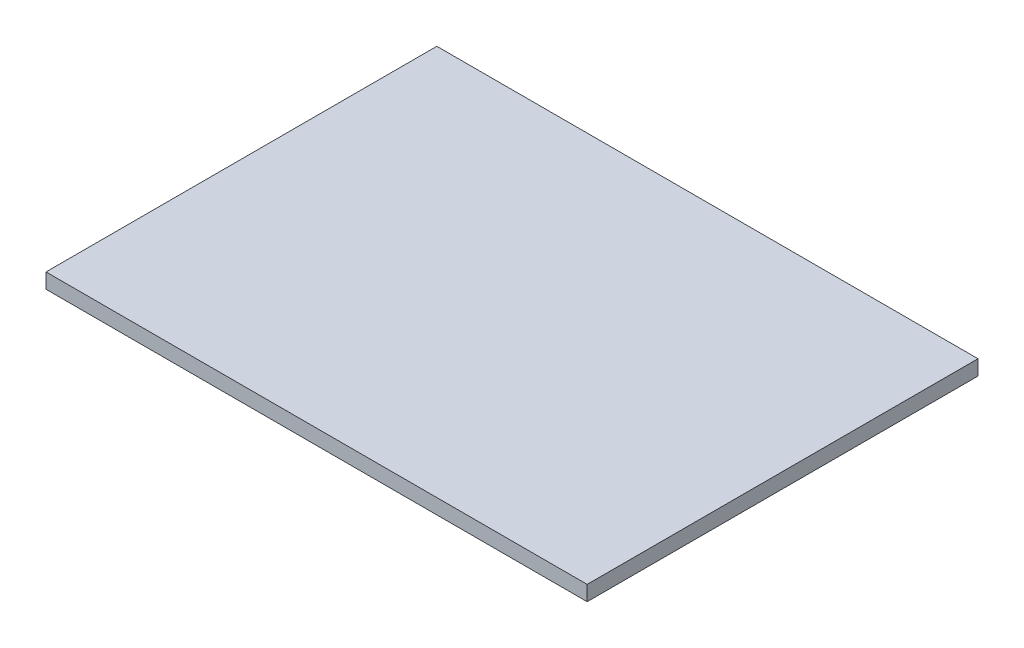
ISO-10303-21;
HEADER;
FILE_DESCRIPTION(('STEP AP214'),'2;1');
FILE_NAME('part.step','',(''),(''),'','','');
FILE_SCHEMA(('AUTOMOTIVE_DESIGN { 1 0 10303 214 1 1 1 1 }'));
ENDSEC;
DATA;
#1=APPLICATION_CONTEXT('core data for automotive mechanical design processes');
#2=APPLICATION_PROTOCOL_DEFINITION('international standard','automotive_design',2000,#1);
#3=PRODUCT_CONTEXT('',#1,'mechanical');
#4=PRODUCT('Part','Part','',(#3));
#5=PRODUCT_RELATED_PRODUCT_CATEGORY('part','',(#4));
#6=PRODUCT_DEFINITION_FORMATION('','',#4);
#7=PRODUCT_DEFINITION_CONTEXT('part definition',#1,'design');
#8=PRODUCT_DEFINITION('design','',#6,#7);
#9=PRODUCT_DEFINITION_SHAPE('','',#8);
#10=(LENGTH_UNIT() NAMED_UNIT(*) SI_UNIT(.MILLI.,.METRE.));
#11=(NAMED_UNIT(*) PLANE_ANGLE_UNIT() SI_UNIT($,.RADIAN.));
#12=(NAMED_UNIT(*) SI_UNIT($,.STERADIAN.) SOLID_ANGLE_UNIT());
#13=UNCERTAINTY_MEASURE_WITH_UNIT(LENGTH_MEASURE(1.E-05),#10,'distance_accuracy_value','');
#14=(GEOMETRIC_REPRESENTATION_CONTEXT(3) GLOBAL_UNCERTAINTY_ASSIGNED_CONTEXT((#13)) GLOBAL_UNIT_ASSIGNED_CONTEXT((#10,
#11,#12)) REPRESENTATION_CONTEXT('',''));
#15=CARTESIAN_POINT('',(0.,0.,0.));
#16=DIRECTION('',(0.,0.,1.));
#17=DIRECTION('',(1.,0.,0.));
#18=AXIS2_PLACEMENT_3D('',#15,#16,#17);
#19=CARTESIAN_POINT('',(0.,5.,0.));
#20=DIRECTION('',(1.,0.,0.));
#21=DIRECTION('',(0.,0.,-1.));
#22=AXIS2_PLACEMENT_3D('',#19,#20,#21);
#23=PLANE('',#22);
#24=DIRECTION('',(0.,0.,1.));
#25=VECTOR('',#24,1.);
#26=CARTESIAN_POINT('',(0.,0.,0.));
#27=LINE('',#26,#25);
#28=CARTESIAN_POINT('',(0.,0.,0.));
#29=VERTEX_POINT('',#28);
#30=CARTESIAN_POINT('',(0.,0.,130.));
#31=VERTEX_POINT('',#30);
#32=EDGE_CURVE('E96',#29,#31,#27,.T.);
#33=ORIENTED_EDGE('',*,*,#32,.T.);
#34=DIRECTION('',(0.,-1.,0.));
#35=VECTOR('',#34,1.);
#36=CARTESIAN_POINT('',(0.,5.,130.));
#37=LINE('',#36,#35);
#38=CARTESIAN_POINT('',(0.,5.,130.));
#39=VERTEX_POINT('',#38);
#40=EDGE_CURVE('E11',#39,#31,#37,.T.);
#41=ORIENTED_EDGE('',*,*,#40,.F.);
#42=DIRECTION('',(0.,0.,1.));
#43=VECTOR('',#42,1.);
#44=CARTESIAN_POINT('',(0.,5.,0.));
#45=LINE('',#44,#43);
#46=CARTESIAN_POINT('',(0.,5.,0.));
#47=VERTEX_POINT('',#46);
#48=EDGE_CURVE('E84',#47,#39,#45,.T.);
#49=ORIENTED_EDGE('',*,*,#48,.F.);
#50=DIRECTION('',(0.,-1.,0.));
#51=VECTOR('',#50,1.);
#52=CARTESIAN_POINT('',(0.,5.,0.));
#53=LINE('',#52,#51);
#54=EDGE_CURVE('E92',#47,#29,#53,.T.);
#55=ORIENTED_EDGE('',*,*,#54,.T.);
#56=EDGE_LOOP('',(#33,#41,#49,#55));
#57=FACE_BOUND('',#56,.T.);
#58=ADVANCED_FACE('F33',(#57),#23,.F.);
#59=CARTESIAN_POINT('',(0.,5.,130.));
#60=DIRECTION('',(0.,0.,-1.));
#61=DIRECTION('',(-1.,0.,0.));
#62=AXIS2_PLACEMENT_3D('',#59,#60,#61);
#63=PLANE('',#62);
#64=DIRECTION('',(1.,0.,0.));
#65=VECTOR('',#64,1.);
#66=CARTESIAN_POINT('',(0.,0.,130.));
#67=LINE('',#66,#65);
#68=CARTESIAN_POINT('',(180.,0.,130.));
#69=VERTEX_POINT('',#68);
#70=EDGE_CURVE('E88',#31,#69,#67,.T.);
#71=ORIENTED_EDGE('',*,*,#70,.T.);
#72=DIRECTION('',(0.,-1.,0.));
#73=VECTOR('',#72,1.);
#74=CARTESIAN_POINT('',(180.,5.,130.));
#75=LINE('',#74,#73);
#76=CARTESIAN_POINT('',(180.,5.,130.));
#77=VERTEX_POINT('',#76);
#78=EDGE_CURVE('E41',#77,#69,#75,.T.);
#79=ORIENTED_EDGE('',*,*,#78,.F.);
#80=DIRECTION('',(1.,0.,0.));
#81=VECTOR('',#80,1.);
#82=CARTESIAN_POINT('',(0.,5.,130.));
#83=LINE('',#82,#81);
#84=EDGE_CURVE('E79',#39,#77,#83,.T.);
#85=ORIENTED_EDGE('',*,*,#84,.F.);
#86=ORIENTED_EDGE('',*,*,#40,.T.);
#87=EDGE_LOOP('',(#71,#79,#85,#86));
#88=FACE_BOUND('',#87,.T.);
#89=ADVANCED_FACE('F87',(#88),#63,.F.);
#90=CARTESIAN_POINT('',(180.,5.,0.));
#91=DIRECTION('',(-1.,0.,0.));
#92=DIRECTION('',(0.,0.,1.));
#93=AXIS2_PLACEMENT_3D('',#90,#91,#92);
#94=PLANE('',#93);
#95=DIRECTION('',(0.,0.,-1.));
#96=VECTOR('',#95,1.);
#97=CARTESIAN_POINT('',(180.,0.,0.));
#98=LINE('',#97,#96);
#99=CARTESIAN_POINT('',(180.,0.,0.));
#100=VERTEX_POINT('',#99);
#101=EDGE_CURVE('E66',#69,#100,#98,.T.);
#102=ORIENTED_EDGE('',*,*,#101,.T.);
#103=DIRECTION('',(0.,-1.,0.));
#104=VECTOR('',#103,1.);
#105=CARTESIAN_POINT('',(180.,5.,0.));
#106=LINE('',#105,#104);
#107=CARTESIAN_POINT('',(180.,5.,0.));
#108=VERTEX_POINT('',#107);
#109=EDGE_CURVE('E89',#108,#100,#106,.T.);
#110=ORIENTED_EDGE('',*,*,#109,.F.);
#111=DIRECTION('',(0.,0.,-1.));
#112=VECTOR('',#111,1.);
#113=CARTESIAN_POINT('',(180.,5.,0.));
#114=LINE('',#113,#112);
#115=EDGE_CURVE('E82',#77,#108,#114,.T.);
#116=ORIENTED_EDGE('',*,*,#115,.F.);
#117=ORIENTED_EDGE('',*,*,#78,.T.);
#118=EDGE_LOOP('',(#102,#110,#116,#117));
#119=FACE_BOUND('',#118,.T.);
#120=ADVANCED_FACE('F90',(#119),#94,.F.);
#121=CARTESIAN_POINT('',(0.,5.,0.));
#122=DIRECTION('',(0.,0.,1.));
#123=DIRECTION('',(1.,0.,0.));
#124=AXIS2_PLACEMENT_3D('',#121,#122,#123);
#125=PLANE('',#124);
#126=DIRECTION('',(-1.,0.,0.));
#127=VECTOR('',#126,1.);
#128=CARTESIAN_POINT('',(0.,0.,0.));
#129=LINE('',#128,#127);
#130=EDGE_CURVE('E72',#100,#29,#129,.T.);
#131=ORIENTED_EDGE('',*,*,#130,.T.);
#132=ORIENTED_EDGE('',*,*,#54,.F.);
#133=DIRECTION('',(-1.,0.,0.));
#134=VECTOR('',#133,1.);
#135=CARTESIAN_POINT('',(0.,5.,0.));
#136=LINE('',#135,#134);
#137=EDGE_CURVE('E49',#108,#47,#136,.T.);
#138=ORIENTED_EDGE('',*,*,#137,.F.);
#139=ORIENTED_EDGE('',*,*,#109,.T.);
#140=EDGE_LOOP('',(#131,#132,#138,#139));
#141=FACE_BOUND('',#140,.T.);
#142=ADVANCED_FACE('F103',(#141),#125,.F.);
#143=CARTESIAN_POINT('',(0.,5.,0.));
#144=DIRECTION('',(0.,1.,0.));
#145=DIRECTION('',(0.,0.,1.));
#146=AXIS2_PLACEMENT_3D('',#143,#144,#145);
#147=PLANE('',#146);
#148=ORIENTED_EDGE('',*,*,#48,.T.);
#149=ORIENTED_EDGE('',*,*,#84,.T.);
#150=ORIENTED_EDGE('',*,*,#115,.T.);
#151=ORIENTED_EDGE('',*,*,#137,.T.);
#152=EDGE_LOOP('',(#148,#149,#150,#151));
#153=FACE_BOUND('',#152,.T.);
#154=ADVANCED_FACE('F80',(#153),#147,.T.);
#155=CARTESIAN_POINT('',(0.,0.,0.));
#156=DIRECTION('',(0.,1.,0.));
#157=DIRECTION('',(0.,0.,1.));
#158=AXIS2_PLACEMENT_3D('',#155,#156,#157);
#159=PLANE('',#158);
#160=ORIENTED_EDGE('',*,*,#32,.F.);
#161=ORIENTED_EDGE('',*,*,#130,.F.);
#162=ORIENTED_EDGE('',*,*,#101,.F.);
#163=ORIENTED_EDGE('',*,*,#70,.F.);
#164=EDGE_LOOP('',(#160,#161,#162,#163));
#165=FACE_BOUND('',#164,.T.);
#166=ADVANCED_FACE('F106',(#165),#159,.F.);
#167=CLOSED_SHELL('',(#58,#89,#120,#142,#154,#166));
#168=MANIFOLD_SOLID_BREP('B2',#167);
#169=ADVANCED_BREP_SHAPE_REPRESENTATION('',(#18,#168),#14);
#170=SHAPE_DEFINITION_REPRESENTATION(#9,#169);
ENDSEC;
END-ISO-10303-21;
